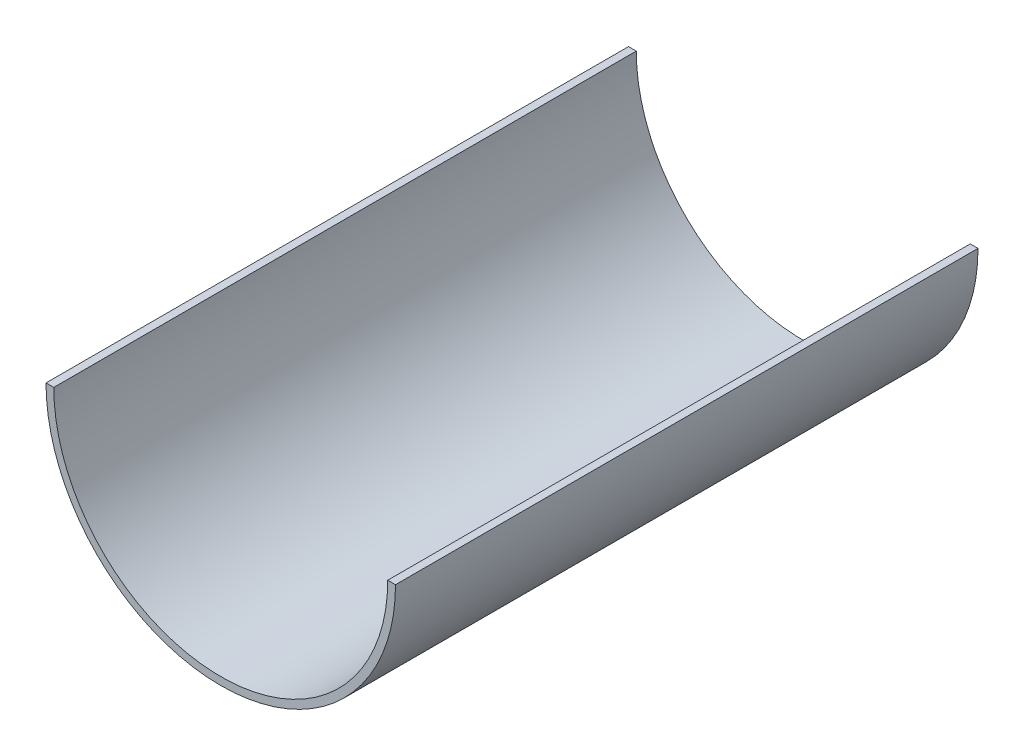
ISO-10303-21;
HEADER;
FILE_DESCRIPTION(('STEP AP214'),'2;1');
FILE_NAME('part.step','',(''),(''),'','','');
FILE_SCHEMA(('AUTOMOTIVE_DESIGN { 1 0 10303 214 1 1 1 1 }'));
ENDSEC;
DATA;
#1=APPLICATION_CONTEXT('core data for automotive mechanical design processes');
#2=APPLICATION_PROTOCOL_DEFINITION('international standard','automotive_design',2000,#1);
#3=PRODUCT_CONTEXT('',#1,'mechanical');
#4=PRODUCT('Part','Part','',(#3));
#5=PRODUCT_RELATED_PRODUCT_CATEGORY('part','',(#4));
#6=PRODUCT_DEFINITION_FORMATION('','',#4);
#7=PRODUCT_DEFINITION_CONTEXT('part definition',#1,'design');
#8=PRODUCT_DEFINITION('design','',#6,#7);
#9=PRODUCT_DEFINITION_SHAPE('','',#8);
#10=(LENGTH_UNIT() NAMED_UNIT(*) SI_UNIT(.MILLI.,.METRE.));
#11=(NAMED_UNIT(*) PLANE_ANGLE_UNIT() SI_UNIT($,.RADIAN.));
#12=(NAMED_UNIT(*) SI_UNIT($,.STERADIAN.) SOLID_ANGLE_UNIT());
#13=UNCERTAINTY_MEASURE_WITH_UNIT(LENGTH_MEASURE(1.E-05),#10,'distance_accuracy_value','');
#14=(GEOMETRIC_REPRESENTATION_CONTEXT(3) GLOBAL_UNCERTAINTY_ASSIGNED_CONTEXT((#13)) GLOBAL_UNIT_ASSIGNED_CONTEXT((#10,
#11,#12)) REPRESENTATION_CONTEXT('',''));
#15=CARTESIAN_POINT('',(0.,0.,0.));
#16=DIRECTION('',(0.,0.,1.));
#17=DIRECTION('',(1.,0.,0.));
#18=AXIS2_PLACEMENT_3D('',#15,#16,#17);
#19=CARTESIAN_POINT('',(0.,0.,150.));
#20=DIRECTION('',(0.,0.,-1.));
#21=DIRECTION('',(-1.,0.,0.));
#22=AXIS2_PLACEMENT_3D('',#19,#20,#21);
#23=CYLINDRICAL_SURFACE('',#22,43.);
#24=CARTESIAN_POINT('',(0.,0.,0.));
#25=DIRECTION('',(0.,0.,-1.));
#26=DIRECTION('',(1.,0.,0.));
#27=AXIS2_PLACEMENT_3D('',#24,#25,#26);
#28=CIRCLE('',#27,43.);
#29=CARTESIAN_POINT('',(43.,0.,0.));
#30=VERTEX_POINT('',#29);
#31=CARTESIAN_POINT('',(-43.,0.,0.));
#32=VERTEX_POINT('',#31);
#33=EDGE_CURVE('E96',#30,#32,#28,.T.);
#34=ORIENTED_EDGE('',*,*,#33,.T.);
#35=DIRECTION('',(0.,0.,-1.));
#36=VECTOR('',#35,1.);
#37=CARTESIAN_POINT('',(-43.,0.,150.));
#38=LINE('',#37,#36);
#39=CARTESIAN_POINT('',(-43.,0.,150.));
#40=VERTEX_POINT('',#39);
#41=EDGE_CURVE('E11',#40,#32,#38,.T.);
#42=ORIENTED_EDGE('',*,*,#41,.F.);
#43=CARTESIAN_POINT('',(0.,0.,150.));
#44=DIRECTION('',(0.,0.,-1.));
#45=DIRECTION('',(1.,0.,0.));
#46=AXIS2_PLACEMENT_3D('',#43,#44,#45);
#47=CIRCLE('',#46,43.);
#48=CARTESIAN_POINT('',(43.,0.,150.));
#49=VERTEX_POINT('',#48);
#50=EDGE_CURVE('E84',#49,#40,#47,.T.);
#51=ORIENTED_EDGE('',*,*,#50,.F.);
#52=DIRECTION('',(0.,0.,-1.));
#53=VECTOR('',#52,1.);
#54=CARTESIAN_POINT('',(43.,0.,150.));
#55=LINE('',#54,#53);
#56=EDGE_CURVE('E92',#49,#30,#55,.T.);
#57=ORIENTED_EDGE('',*,*,#56,.T.);
#58=EDGE_LOOP('',(#34,#42,#51,#57));
#59=FACE_BOUND('',#58,.T.);
#60=ADVANCED_FACE('F33',(#59),#23,.F.);
#61=CARTESIAN_POINT('',(-45.,0.,150.));
#62=DIRECTION('',(0.,-1.,0.));
#63=DIRECTION('',(1.,0.,0.));
#64=AXIS2_PLACEMENT_3D('',#61,#62,#63);
#65=PLANE('',#64);
#66=DIRECTION('',(-1.,0.,0.));
#67=VECTOR('',#66,1.);
#68=CARTESIAN_POINT('',(-45.,0.,0.));
#69=LINE('',#68,#67);
#70=CARTESIAN_POINT('',(-45.,0.,0.));
#71=VERTEX_POINT('',#70);
#72=EDGE_CURVE('E88',#32,#71,#69,.T.);
#73=ORIENTED_EDGE('',*,*,#72,.T.);
#74=DIRECTION('',(0.,0.,-1.));
#75=VECTOR('',#74,1.);
#76=CARTESIAN_POINT('',(-45.,0.,150.));
#77=LINE('',#76,#75);
#78=CARTESIAN_POINT('',(-45.,0.,150.));
#79=VERTEX_POINT('',#78);
#80=EDGE_CURVE('E41',#79,#71,#77,.T.);
#81=ORIENTED_EDGE('',*,*,#80,.F.);
#82=DIRECTION('',(-1.,0.,0.));
#83=VECTOR('',#82,1.);
#84=CARTESIAN_POINT('',(-45.,0.,150.));
#85=LINE('',#84,#83);
#86=EDGE_CURVE('E79',#40,#79,#85,.T.);
#87=ORIENTED_EDGE('',*,*,#86,.F.);
#88=ORIENTED_EDGE('',*,*,#41,.T.);
#89=EDGE_LOOP('',(#73,#81,#87,#88));
#90=FACE_BOUND('',#89,.T.);
#91=ADVANCED_FACE('F87',(#90),#65,.F.);
#92=CARTESIAN_POINT('',(0.,0.,150.));
#93=DIRECTION('',(0.,0.,-1.));
#94=DIRECTION('',(-1.,0.,0.));
#95=AXIS2_PLACEMENT_3D('',#92,#93,#94);
#96=CYLINDRICAL_SURFACE('',#95,45.);
#97=CARTESIAN_POINT('',(0.,0.,0.));
#98=DIRECTION('',(0.,0.,1.));
#99=DIRECTION('',(1.,0.,0.));
#100=AXIS2_PLACEMENT_3D('',#97,#98,#99);
#101=CIRCLE('',#100,45.);
#102=CARTESIAN_POINT('',(45.,0.,0.));
#103=VERTEX_POINT('',#102);
#104=EDGE_CURVE('E66',#71,#103,#101,.T.);
#105=ORIENTED_EDGE('',*,*,#104,.T.);
#106=DIRECTION('',(0.,0.,-1.));
#107=VECTOR('',#106,1.);
#108=CARTESIAN_POINT('',(45.,0.,150.));
#109=LINE('',#108,#107);
#110=CARTESIAN_POINT('',(45.,0.,150.));
#111=VERTEX_POINT('',#110);
#112=EDGE_CURVE('E89',#111,#103,#109,.T.);
#113=ORIENTED_EDGE('',*,*,#112,.F.);
#114=CARTESIAN_POINT('',(0.,0.,150.));
#115=DIRECTION('',(0.,0.,1.));
#116=DIRECTION('',(1.,0.,0.));
#117=AXIS2_PLACEMENT_3D('',#114,#115,#116);
#118=CIRCLE('',#117,45.);
#119=EDGE_CURVE('E82',#79,#111,#118,.T.);
#120=ORIENTED_EDGE('',*,*,#119,.F.);
#121=ORIENTED_EDGE('',*,*,#80,.T.);
#122=EDGE_LOOP('',(#105,#113,#120,#121));
#123=FACE_BOUND('',#122,.T.);
#124=ADVANCED_FACE('F90',(#123),#96,.T.);
#125=CARTESIAN_POINT('',(43.,0.,150.));
#126=DIRECTION('',(0.,-1.,0.));
#127=DIRECTION('',(1.,0.,0.));
#128=AXIS2_PLACEMENT_3D('',#125,#126,#127);
#129=PLANE('',#128);
#130=DIRECTION('',(-1.,0.,0.));
#131=VECTOR('',#130,1.);
#132=CARTESIAN_POINT('',(43.,0.,0.));
#133=LINE('',#132,#131);
#134=EDGE_CURVE('E72',#103,#30,#133,.T.);
#135=ORIENTED_EDGE('',*,*,#134,.T.);
#136=ORIENTED_EDGE('',*,*,#56,.F.);
#137=DIRECTION('',(-1.,0.,0.));
#138=VECTOR('',#137,1.);
#139=CARTESIAN_POINT('',(43.,0.,150.));
#140=LINE('',#139,#138);
#141=EDGE_CURVE('E49',#111,#49,#140,.T.);
#142=ORIENTED_EDGE('',*,*,#141,.F.);
#143=ORIENTED_EDGE('',*,*,#112,.T.);
#144=EDGE_LOOP('',(#135,#136,#142,#143));
#145=FACE_BOUND('',#144,.T.);
#146=ADVANCED_FACE('F103',(#145),#129,.F.);
#147=CARTESIAN_POINT('',(0.,0.,150.));
#148=DIRECTION('',(0.,0.,1.));
#149=DIRECTION('',(1.,0.,0.));
#150=AXIS2_PLACEMENT_3D('',#147,#148,#149);
#151=PLANE('',#150);
#152=ORIENTED_EDGE('',*,*,#50,.T.);
#153=ORIENTED_EDGE('',*,*,#86,.T.);
#154=ORIENTED_EDGE('',*,*,#119,.T.);
#155=ORIENTED_EDGE('',*,*,#141,.T.);
#156=EDGE_LOOP('',(#152,#153,#154,#155));
#157=FACE_BOUND('',#156,.T.);
#158=ADVANCED_FACE('F80',(#157),#151,.T.);
#159=CARTESIAN_POINT('',(0.,0.,0.));
#160=DIRECTION('',(0.,0.,1.));
#161=DIRECTION('',(1.,0.,0.));
#162=AXIS2_PLACEMENT_3D('',#159,#160,#161);
#163=PLANE('',#162);
#164=ORIENTED_EDGE('',*,*,#33,.F.);
#165=ORIENTED_EDGE('',*,*,#134,.F.);
#166=ORIENTED_EDGE('',*,*,#104,.F.);
#167=ORIENTED_EDGE('',*,*,#72,.F.);
#168=EDGE_LOOP('',(#164,#165,#166,#167));
#169=FACE_BOUND('',#168,.T.);
#170=ADVANCED_FACE('F106',(#169),#163,.F.);
#171=CLOSED_SHELL('',(#60,#91,#124,#146,#158,#170));
#172=MANIFOLD_SOLID_BREP('B2',#171);
#173=ADVANCED_BREP_SHAPE_REPRESENTATION('',(#18,#172),#14);
#174=SHAPE_DEFINITION_REPRESENTATION(#9,#173);
ENDSEC;
END-ISO-10303-21;
